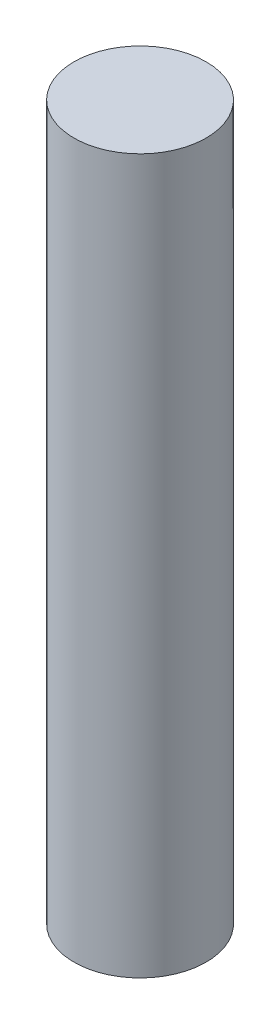
ISO-10303-21;
HEADER;
FILE_DESCRIPTION(('STEP AP214'),'2;1');
FILE_NAME('part.step','',(''),(''),'','','');
FILE_SCHEMA(('AUTOMOTIVE_DESIGN { 1 0 10303 214 1 1 1 1 }'));
ENDSEC;
DATA;
#1=APPLICATION_CONTEXT('core data for automotive mechanical design processes');
#2=APPLICATION_PROTOCOL_DEFINITION('international standard','automotive_design',2000,#1);
#3=PRODUCT_CONTEXT('',#1,'mechanical');
#4=PRODUCT('Part','Part','',(#3));
#5=PRODUCT_RELATED_PRODUCT_CATEGORY('part','',(#4));
#6=PRODUCT_DEFINITION_FORMATION('','',#4);
#7=PRODUCT_DEFINITION_CONTEXT('part definition',#1,'design');
#8=PRODUCT_DEFINITION('design','',#6,#7);
#9=PRODUCT_DEFINITION_SHAPE('','',#8);
#10=(LENGTH_UNIT() NAMED_UNIT(*) SI_UNIT(.MILLI.,.METRE.));
#11=(NAMED_UNIT(*) PLANE_ANGLE_UNIT() SI_UNIT($,.RADIAN.));
#12=(NAMED_UNIT(*) SI_UNIT($,.STERADIAN.) SOLID_ANGLE_UNIT());
#13=UNCERTAINTY_MEASURE_WITH_UNIT(LENGTH_MEASURE(1.E-05),#10,'distance_accuracy_value','');
#14=(GEOMETRIC_REPRESENTATION_CONTEXT(3) GLOBAL_UNCERTAINTY_ASSIGNED_CONTEXT((#13)) GLOBAL_UNIT_ASSIGNED_CONTEXT((#10,
#11,#12)) REPRESENTATION_CONTEXT('',''));
#15=CARTESIAN_POINT('',(0.,0.,0.));
#16=DIRECTION('',(0.,0.,1.));
#17=DIRECTION('',(1.,0.,0.));
#18=AXIS2_PLACEMENT_3D('',#15,#16,#17);
#19=CARTESIAN_POINT('',(0.,21.6,0.));
#20=DIRECTION('',(0.,-1.,0.));
#21=DIRECTION('',(0.,0.,-1.));
#22=AXIS2_PLACEMENT_3D('',#19,#20,#21);
#23=CYLINDRICAL_SURFACE('',#22,2.);
#24=CARTESIAN_POINT('',(0.,21.6,0.));
#25=DIRECTION('',(0.,1.,0.));
#26=DIRECTION('',(0.,0.,1.));
#27=AXIS2_PLACEMENT_3D('',#24,#25,#26);
#28=CIRCLE('',#27,2.);
#29=CARTESIAN_POINT('',(0.,21.6,-2.));
#30=VERTEX_POINT('',#29);
#31=EDGE_CURVE('E10',#30,#30,#28,.T.);
#32=CARTESIAN_POINT('',(0.,0.,0.));
#33=DIRECTION('',(0.,1.,0.));
#34=DIRECTION('',(0.,0.,1.));
#35=AXIS2_PLACEMENT_3D('',#32,#33,#34);
#36=CIRCLE('',#35,2.);
#37=CARTESIAN_POINT('',(0.,0.,-2.));
#38=VERTEX_POINT('',#37);
#39=EDGE_CURVE('E33',#38,#38,#36,.T.);
#40=CARTESIAN_POINT('',(0.,21.6,-2.));
#41=CARTESIAN_POINT('',(0.,21.375,-2.));
#42=CARTESIAN_POINT('',(0.,21.15,-2.));
#43=CARTESIAN_POINT('',(0.,20.7,-2.));
#44=CARTESIAN_POINT('',(0.,20.475,-2.));
#45=CARTESIAN_POINT('',(0.,20.025,-2.));
#46=CARTESIAN_POINT('',(0.,19.8,-2.));
#47=CARTESIAN_POINT('',(0.,19.35,-2.));
#48=CARTESIAN_POINT('',(0.,19.125,-2.));
#49=CARTESIAN_POINT('',(0.,18.675,-2.));
#50=CARTESIAN_POINT('',(0.,18.45,-2.));
#51=CARTESIAN_POINT('',(0.,18.,-2.));
#52=CARTESIAN_POINT('',(0.,17.775,-2.));
#53=CARTESIAN_POINT('',(0.,17.325,-2.));
#54=CARTESIAN_POINT('',(0.,17.1,-2.));
#55=CARTESIAN_POINT('',(0.,16.65,-2.));
#56=CARTESIAN_POINT('',(0.,16.425,-2.));
#57=CARTESIAN_POINT('',(0.,15.975,-2.));
#58=CARTESIAN_POINT('',(0.,15.75,-2.));
#59=CARTESIAN_POINT('',(0.,15.3,-2.));
#60=CARTESIAN_POINT('',(0.,15.075,-2.));
#61=CARTESIAN_POINT('',(0.,14.625,-2.));
#62=CARTESIAN_POINT('',(0.,14.4,-2.));
#63=CARTESIAN_POINT('',(0.,13.95,-2.));
#64=CARTESIAN_POINT('',(0.,13.725,-2.));
#65=CARTESIAN_POINT('',(0.,13.275,-2.));
#66=CARTESIAN_POINT('',(0.,13.05,-2.));
#67=CARTESIAN_POINT('',(0.,12.6,-2.));
#68=CARTESIAN_POINT('',(0.,12.375,-2.));
#69=CARTESIAN_POINT('',(0.,11.925,-2.));
#70=CARTESIAN_POINT('',(0.,11.7,-2.));
#71=CARTESIAN_POINT('',(0.,11.25,-2.));
#72=CARTESIAN_POINT('',(0.,11.025,-2.));
#73=CARTESIAN_POINT('',(0.,10.575,-2.));
#74=CARTESIAN_POINT('',(0.,10.35,-2.));
#75=CARTESIAN_POINT('',(0.,9.9,-2.));
#76=CARTESIAN_POINT('',(0.,9.675,-2.));
#77=CARTESIAN_POINT('',(0.,9.225,-2.));
#78=CARTESIAN_POINT('',(0.,9.,-2.));
#79=CARTESIAN_POINT('',(0.,8.55,-2.));
#80=CARTESIAN_POINT('',(0.,8.325,-2.));
#81=CARTESIAN_POINT('',(0.,7.875,-2.));
#82=CARTESIAN_POINT('',(0.,7.65,-2.));
#83=CARTESIAN_POINT('',(0.,7.2,-2.));
#84=CARTESIAN_POINT('',(0.,6.975,-2.));
#85=CARTESIAN_POINT('',(0.,6.525,-2.));
#86=CARTESIAN_POINT('',(0.,6.3,-2.));
#87=CARTESIAN_POINT('',(0.,5.85,-2.));
#88=CARTESIAN_POINT('',(0.,5.625,-2.));
#89=CARTESIAN_POINT('',(0.,5.175,-2.));
#90=CARTESIAN_POINT('',(0.,4.95,-2.));
#91=CARTESIAN_POINT('',(0.,4.5,-2.));
#92=CARTESIAN_POINT('',(0.,4.275,-2.));
#93=CARTESIAN_POINT('',(0.,3.825,-2.));
#94=CARTESIAN_POINT('',(0.,3.6,-2.));
#95=CARTESIAN_POINT('',(0.,3.15,-2.));
#96=CARTESIAN_POINT('',(0.,2.925,-2.));
#97=CARTESIAN_POINT('',(0.,2.475,-2.));
#98=CARTESIAN_POINT('',(0.,2.25,-2.));
#99=CARTESIAN_POINT('',(0.,1.8,-2.));
#100=CARTESIAN_POINT('',(0.,1.575,-2.));
#101=CARTESIAN_POINT('',(0.,1.125,-2.));
#102=CARTESIAN_POINT('',(0.,0.899999999999998,-2.));
#103=CARTESIAN_POINT('',(0.,0.449999999999998,-2.));
#104=CARTESIAN_POINT('',(0.,0.224999999999997,-2.));
#105=CARTESIAN_POINT('',(0.,0.,-2.));
#106=B_SPLINE_CURVE_WITH_KNOTS('',3,(#40,#41,#42,#43,#44,#45,#46,#47,#48,#49,#50,#51,#52,#53,
#54,#55,#56,#57,#58,#59,#60,#61,#62,#63,#64,#65,#66,#67,#68,#69,#70,#71,#72,#73,#74,#75,#76,#77,
#78,#79,#80,#81,#82,#83,#84,#85,#86,#87,#88,#89,#90,#91,#92,#93,#94,#95,#96,#97,#98,#99,#100,
#101,#102,#103,#104,#105),.UNSPECIFIED.,.F.,.F.,(4,2,2,2,2,2,2,2,2,2,2,2,2,2,2,2,2,2,2,2,2,2,2,
2,2,2,2,2,2,2,2,2,4),(0.,0.675000000000002,1.35,2.025,2.7,3.375,4.05,4.725,5.4,6.075,6.75,7.425,
8.1,8.775,9.45,10.125,10.8,11.475,12.15,12.825,13.5,14.175,14.85,15.525,16.2,16.875,17.55,
18.225,18.9,19.575,20.25,20.925,21.6),.UNSPECIFIED.);
#107=EDGE_CURVE('BSEAM30',#30,#38,#106,.T.);
#108=ORIENTED_EDGE('',*,*,#31,.F.);
#109=ORIENTED_EDGE('',*,*,#39,.T.);
#110=ORIENTED_EDGE('',*,*,#107,.T.);
#111=ORIENTED_EDGE('',*,*,#107,.F.);
#112=EDGE_LOOP('',(#108,#110,#109,#111));
#113=FACE_BOUND('',#112,.T.);
#114=ADVANCED_FACE('F30',(#113),#23,.T.);
#115=CARTESIAN_POINT('',(0.,21.6,0.));
#116=DIRECTION('',(0.,1.,0.));
#117=DIRECTION('',(0.,0.,1.));
#118=AXIS2_PLACEMENT_3D('',#115,#116,#117);
#119=PLANE('',#118);
#120=ORIENTED_EDGE('',*,*,#31,.T.);
#121=EDGE_LOOP('',(#120));
#122=FACE_BOUND('',#121,.T.);
#123=ADVANCED_FACE('F45',(#122),#119,.T.);
#124=CARTESIAN_POINT('',(0.,0.,0.));
#125=DIRECTION('',(0.,1.,0.));
#126=DIRECTION('',(0.,0.,1.));
#127=AXIS2_PLACEMENT_3D('',#124,#125,#126);
#128=PLANE('',#127);
#129=ORIENTED_EDGE('',*,*,#39,.F.);
#130=EDGE_LOOP('',(#129));
#131=FACE_BOUND('',#130,.T.);
#132=ADVANCED_FACE('F43',(#131),#128,.F.);
#133=CLOSED_SHELL('',(#114,#123,#132));
#134=MANIFOLD_SOLID_BREP('B2',#133);
#135=ADVANCED_BREP_SHAPE_REPRESENTATION('',(#18,#134),#14);
#136=SHAPE_DEFINITION_REPRESENTATION(#9,#135);
ENDSEC;
END-ISO-10303-21;
